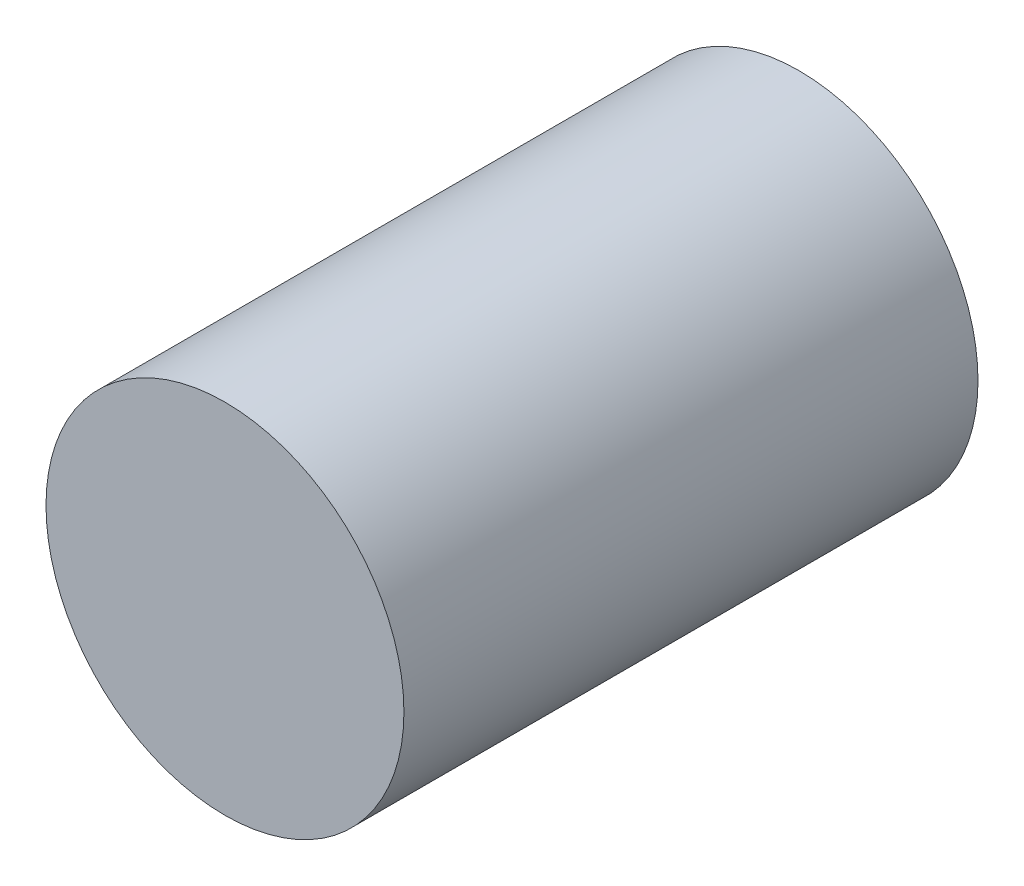
ISO-10303-21;
HEADER;
FILE_DESCRIPTION(('STEP AP214'),'2;1');
FILE_NAME('part.step','',(''),(''),'','','');
FILE_SCHEMA(('AUTOMOTIVE_DESIGN { 1 0 10303 214 1 1 1 1 }'));
ENDSEC;
DATA;
#1=APPLICATION_CONTEXT('core data for automotive mechanical design processes');
#2=APPLICATION_PROTOCOL_DEFINITION('international standard','automotive_design',2000,#1);
#3=PRODUCT_CONTEXT('',#1,'mechanical');
#4=PRODUCT('Part','Part','',(#3));
#5=PRODUCT_RELATED_PRODUCT_CATEGORY('part','',(#4));
#6=PRODUCT_DEFINITION_FORMATION('','',#4);
#7=PRODUCT_DEFINITION_CONTEXT('part definition',#1,'design');
#8=PRODUCT_DEFINITION('design','',#6,#7);
#9=PRODUCT_DEFINITION_SHAPE('','',#8);
#10=(LENGTH_UNIT() NAMED_UNIT(*) SI_UNIT(.MILLI.,.METRE.));
#11=(NAMED_UNIT(*) PLANE_ANGLE_UNIT() SI_UNIT($,.RADIAN.));
#12=(NAMED_UNIT(*) SI_UNIT($,.STERADIAN.) SOLID_ANGLE_UNIT());
#13=UNCERTAINTY_MEASURE_WITH_UNIT(LENGTH_MEASURE(1.E-05),#10,'distance_accuracy_value','');
#14=(GEOMETRIC_REPRESENTATION_CONTEXT(3) GLOBAL_UNCERTAINTY_ASSIGNED_CONTEXT((#13)) GLOBAL_UNIT_ASSIGNED_CONTEXT((#10,
#11,#12)) REPRESENTATION_CONTEXT('',''));
#15=CARTESIAN_POINT('',(0.,0.,0.));
#16=DIRECTION('',(0.,0.,1.));
#17=DIRECTION('',(1.,0.,0.));
#18=AXIS2_PLACEMENT_3D('',#15,#16,#17);
#19=CARTESIAN_POINT('',(-0.999999999999999,0.,0.5));
#20=DIRECTION('',(0.,0.,-1.));
#21=DIRECTION('',(-1.,0.,0.));
#22=AXIS2_PLACEMENT_3D('',#19,#20,#21);
#23=CYLINDRICAL_SURFACE('',#22,0.311736685304395);
#24=CARTESIAN_POINT('',(-0.999999999999999,0.,0.5));
#25=DIRECTION('',(0.,0.,1.));
#26=DIRECTION('',(1.,0.,0.));
#27=AXIS2_PLACEMENT_3D('',#24,#25,#26);
#28=CIRCLE('',#27,0.311736685304395);
#29=CARTESIAN_POINT('',(-0.688263314695604,0.,0.5));
#30=VERTEX_POINT('',#29);
#31=EDGE_CURVE('E10',#30,#30,#28,.T.);
#32=ORIENTED_EDGE('',*,*,#31,.F.);
#33=EDGE_LOOP('',(#32));
#34=FACE_BOUND('',#33,.T.);
#35=CARTESIAN_POINT('',(-0.999999999999999,0.,-0.5));
#36=DIRECTION('',(0.,0.,1.));
#37=DIRECTION('',(1.,0.,0.));
#38=AXIS2_PLACEMENT_3D('',#35,#36,#37);
#39=CIRCLE('',#38,0.311736685304395);
#40=CARTESIAN_POINT('',(-0.688263314695604,0.,-0.5));
#41=VERTEX_POINT('',#40);
#42=EDGE_CURVE('E36',#41,#41,#39,.T.);
#43=ORIENTED_EDGE('',*,*,#42,.T.);
#44=EDGE_LOOP('',(#43));
#45=FACE_BOUND('',#44,.T.);
#46=ADVANCED_FACE('F33',(#34,#45),#23,.T.);
#47=CARTESIAN_POINT('',(-0.999999999999999,0.,0.5));
#48=DIRECTION('',(0.,0.,1.));
#49=DIRECTION('',(1.,0.,0.));
#50=AXIS2_PLACEMENT_3D('',#47,#48,#49);
#51=PLANE('',#50);
#52=ORIENTED_EDGE('',*,*,#31,.T.);
#53=EDGE_LOOP('',(#52));
#54=FACE_BOUND('',#53,.T.);
#55=ADVANCED_FACE('F48',(#54),#51,.T.);
#56=CARTESIAN_POINT('',(-0.999999999999999,0.,-0.5));
#57=DIRECTION('',(0.,0.,1.));
#58=DIRECTION('',(1.,0.,0.));
#59=AXIS2_PLACEMENT_3D('',#56,#57,#58);
#60=PLANE('',#59);
#61=ORIENTED_EDGE('',*,*,#42,.F.);
#62=EDGE_LOOP('',(#61));
#63=FACE_BOUND('',#62,.T.);
#64=ADVANCED_FACE('F46',(#63),#60,.F.);
#65=CLOSED_SHELL('',(#46,#55,#64));
#66=MANIFOLD_SOLID_BREP('B2',#65);
#67=ADVANCED_BREP_SHAPE_REPRESENTATION('',(#18,#66),#14);
#68=SHAPE_DEFINITION_REPRESENTATION(#9,#67);
ENDSEC;
END-ISO-10303-21;
